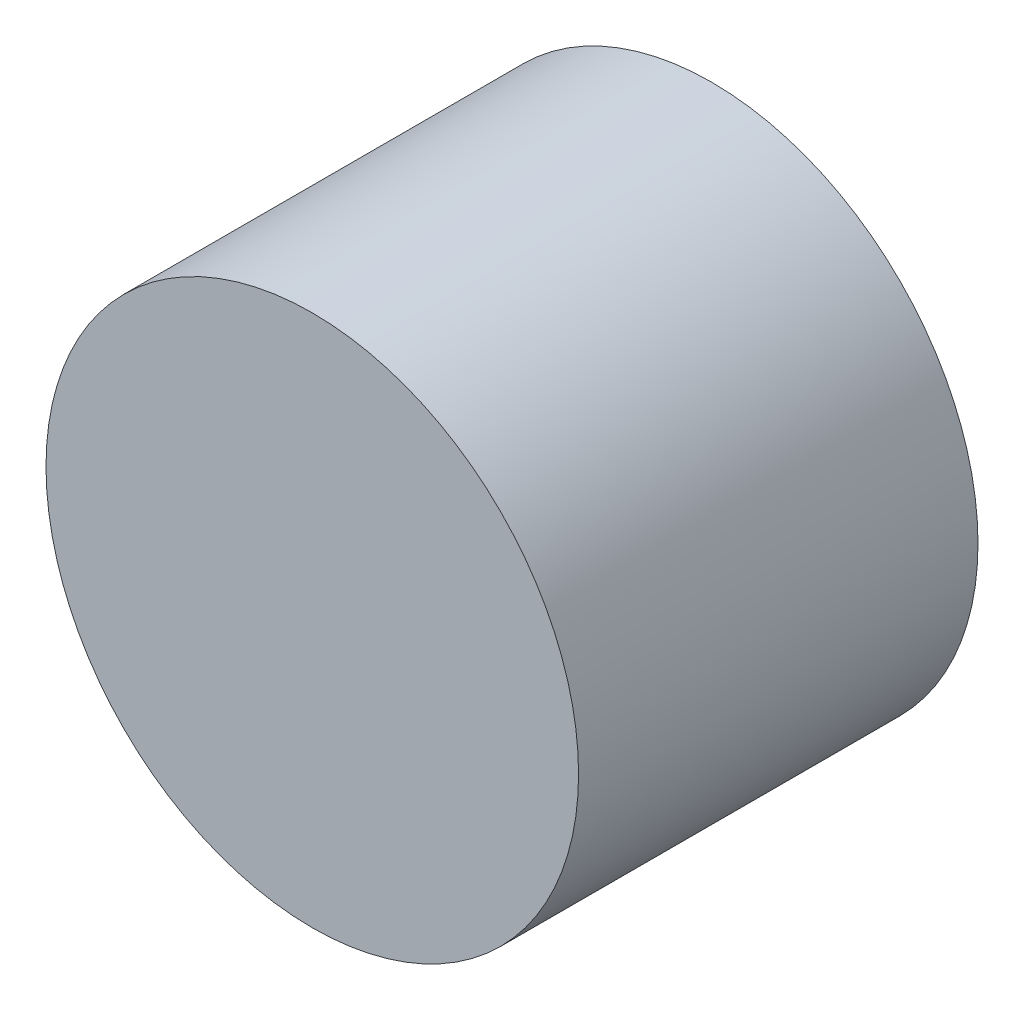
ISO-10303-21;
HEADER;
FILE_DESCRIPTION(('STEP AP214'),'2;1');
FILE_NAME('part.step','',(''),(''),'','','');
FILE_SCHEMA(('AUTOMOTIVE_DESIGN { 1 0 10303 214 1 1 1 1 }'));
ENDSEC;
DATA;
#1=APPLICATION_CONTEXT('core data for automotive mechanical design processes');
#2=APPLICATION_PROTOCOL_DEFINITION('international standard','automotive_design',2000,#1);
#3=PRODUCT_CONTEXT('',#1,'mechanical');
#4=PRODUCT('Part','Part','',(#3));
#5=PRODUCT_RELATED_PRODUCT_CATEGORY('part','',(#4));
#6=PRODUCT_DEFINITION_FORMATION('','',#4);
#7=PRODUCT_DEFINITION_CONTEXT('part definition',#1,'design');
#8=PRODUCT_DEFINITION('design','',#6,#7);
#9=PRODUCT_DEFINITION_SHAPE('','',#8);
#10=(LENGTH_UNIT() NAMED_UNIT(*) SI_UNIT(.MILLI.,.METRE.));
#11=(NAMED_UNIT(*) PLANE_ANGLE_UNIT() SI_UNIT($,.RADIAN.));
#12=(NAMED_UNIT(*) SI_UNIT($,.STERADIAN.) SOLID_ANGLE_UNIT());
#13=UNCERTAINTY_MEASURE_WITH_UNIT(LENGTH_MEASURE(1.E-05),#10,'distance_accuracy_value','');
#14=(GEOMETRIC_REPRESENTATION_CONTEXT(3) GLOBAL_UNCERTAINTY_ASSIGNED_CONTEXT((#13)) GLOBAL_UNIT_ASSIGNED_CONTEXT((#10,
#11,#12)) REPRESENTATION_CONTEXT('',''));
#15=CARTESIAN_POINT('',(0.,0.,0.));
#16=DIRECTION('',(0.,0.,1.));
#17=DIRECTION('',(1.,0.,0.));
#18=AXIS2_PLACEMENT_3D('',#15,#16,#17);
#19=CARTESIAN_POINT('',(151.763944170694,-0.199999999999988,-3.));
#20=DIRECTION('',(0.,0.,1.));
#21=DIRECTION('',(1.,0.,0.));
#22=AXIS2_PLACEMENT_3D('',#19,#20,#21);
#23=CYLINDRICAL_SURFACE('',#22,2.);
#24=CARTESIAN_POINT('',(151.763944170694,-0.199999999999988,-3.));
#25=DIRECTION('',(0.,0.,1.));
#26=DIRECTION('',(1.,0.,0.));
#27=AXIS2_PLACEMENT_3D('',#24,#25,#26);
#28=CIRCLE('',#27,2.);
#29=CARTESIAN_POINT('',(153.763944170694,-0.199999999999988,-3.));
#30=VERTEX_POINT('',#29);
#31=EDGE_CURVE('E10',#30,#30,#28,.T.);
#32=ORIENTED_EDGE('',*,*,#31,.T.);
#33=EDGE_LOOP('',(#32));
#34=FACE_BOUND('',#33,.T.);
#35=CARTESIAN_POINT('',(151.763944170694,-0.199999999999988,0.));
#36=DIRECTION('',(0.,0.,1.));
#37=DIRECTION('',(1.,0.,0.));
#38=AXIS2_PLACEMENT_3D('',#35,#36,#37);
#39=CIRCLE('',#38,2.);
#40=CARTESIAN_POINT('',(153.763944170694,-0.199999999999988,0.));
#41=VERTEX_POINT('',#40);
#42=EDGE_CURVE('E36',#41,#41,#39,.T.);
#43=ORIENTED_EDGE('',*,*,#42,.F.);
#44=EDGE_LOOP('',(#43));
#45=FACE_BOUND('',#44,.T.);
#46=ADVANCED_FACE('F33',(#34,#45),#23,.T.);
#47=CARTESIAN_POINT('',(151.763944170694,-0.199999999999988,-3.));
#48=DIRECTION('',(0.,0.,1.));
#49=DIRECTION('',(1.,0.,0.));
#50=AXIS2_PLACEMENT_3D('',#47,#48,#49);
#51=PLANE('',#50);
#52=ORIENTED_EDGE('',*,*,#31,.F.);
#53=EDGE_LOOP('',(#52));
#54=FACE_BOUND('',#53,.T.);
#55=ADVANCED_FACE('F49',(#54),#51,.F.);
#56=CARTESIAN_POINT('',(151.763944170694,-0.199999999999988,0.));
#57=DIRECTION('',(0.,0.,1.));
#58=DIRECTION('',(1.,0.,0.));
#59=AXIS2_PLACEMENT_3D('',#56,#57,#58);
#60=PLANE('',#59);
#61=ORIENTED_EDGE('',*,*,#42,.T.);
#62=EDGE_LOOP('',(#61));
#63=FACE_BOUND('',#62,.T.);
#64=ADVANCED_FACE('F46',(#63),#60,.T.);
#65=CLOSED_SHELL('',(#46,#55,#64));
#66=MANIFOLD_SOLID_BREP('B2',#65);
#67=ADVANCED_BREP_SHAPE_REPRESENTATION('',(#18,#66),#14);
#68=SHAPE_DEFINITION_REPRESENTATION(#9,#67);
ENDSEC;
END-ISO-10303-21;
